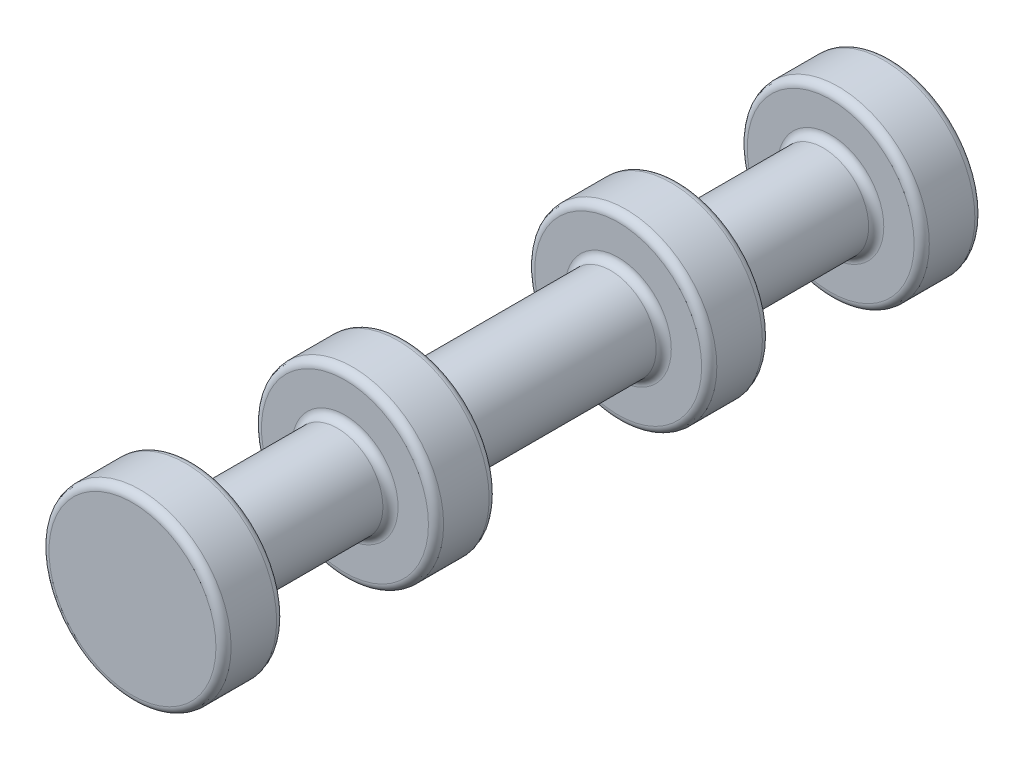
ISO-10303-21;
HEADER;
FILE_DESCRIPTION(('STEP AP214'),'2;1');
FILE_NAME('part.step','',(''),(''),'','','');
FILE_SCHEMA(('AUTOMOTIVE_DESIGN { 1 0 10303 214 1 1 1 1 }'));
ENDSEC;
DATA;
#1=APPLICATION_CONTEXT('core data for automotive mechanical design processes');
#2=APPLICATION_PROTOCOL_DEFINITION('international standard','automotive_design',2000,#1);
#3=PRODUCT_CONTEXT('',#1,'mechanical');
#4=PRODUCT('Part','Part','',(#3));
#5=PRODUCT_RELATED_PRODUCT_CATEGORY('part','',(#4));
#6=PRODUCT_DEFINITION_FORMATION('','',#4);
#7=PRODUCT_DEFINITION_CONTEXT('part definition',#1,'design');
#8=PRODUCT_DEFINITION('design','',#6,#7);
#9=PRODUCT_DEFINITION_SHAPE('','',#8);
#10=(LENGTH_UNIT() NAMED_UNIT(*) SI_UNIT(.MILLI.,.METRE.));
#11=(NAMED_UNIT(*) PLANE_ANGLE_UNIT() SI_UNIT($,.RADIAN.));
#12=(NAMED_UNIT(*) SI_UNIT($,.STERADIAN.) SOLID_ANGLE_UNIT());
#13=UNCERTAINTY_MEASURE_WITH_UNIT(LENGTH_MEASURE(1.E-05),#10,'distance_accuracy_value','');
#14=(GEOMETRIC_REPRESENTATION_CONTEXT(3) GLOBAL_UNCERTAINTY_ASSIGNED_CONTEXT((#13)) GLOBAL_UNIT_ASSIGNED_CONTEXT((#10,
#11,#12)) REPRESENTATION_CONTEXT('',''));
#15=CARTESIAN_POINT('',(0.,0.,0.));
#16=DIRECTION('',(0.,0.,1.));
#17=DIRECTION('',(1.,0.,0.));
#18=AXIS2_PLACEMENT_3D('',#15,#16,#17);
#19=CARTESIAN_POINT('',(-0.84804753819847,0.,9.76740237690729));
#20=DIRECTION('',(0.,0.,-1.));
#21=DIRECTION('',(-1.,0.,0.));
#22=AXIS2_PLACEMENT_3D('',#19,#20,#21);
#23=PLANE('',#22);
#24=CARTESIAN_POINT('',(-0.84804753819847,0.,9.76740237690729));
#25=DIRECTION('',(0.,0.,1.));
#26=DIRECTION('',(1.,0.,0.));
#27=AXIS2_PLACEMENT_3D('',#24,#25,#26);
#28=CIRCLE('',#27,2.75);
#29=CARTESIAN_POINT('',(1.90195246180153,0.,9.76740237690729));
#30=VERTEX_POINT('',#29);
#31=EDGE_CURVE('E10',#30,#30,#28,.T.);
#32=ORIENTED_EDGE('',*,*,#31,.T.);
#33=EDGE_LOOP('',(#32));
#34=FACE_BOUND('',#33,.T.);
#35=ADVANCED_FACE('F35',(#34),#23,.F.);
#36=CARTESIAN_POINT('',(-0.84804753819847,0.,9.51740237690729));
#37=DIRECTION('',(0.,0.,1.));
#38=DIRECTION('',(1.,0.,0.));
#39=AXIS2_PLACEMENT_3D('',#36,#37,#38);
#40=TOROIDAL_SURFACE('',#39,2.75,0.25);
#41=ORIENTED_EDGE('',*,*,#31,.F.);
#42=EDGE_LOOP('',(#41));
#43=FACE_BOUND('',#42,.T.);
#44=CARTESIAN_POINT('',(-0.84804753819847,0.,9.51740237690729));
#45=DIRECTION('',(0.,0.,1.));
#46=DIRECTION('',(1.,0.,0.));
#47=AXIS2_PLACEMENT_3D('',#44,#45,#46);
#48=CIRCLE('',#47,3.);
#49=CARTESIAN_POINT('',(2.15195246180153,0.,9.51740237690729));
#50=VERTEX_POINT('',#49);
#51=EDGE_CURVE('E41',#50,#50,#48,.T.);
#52=ORIENTED_EDGE('',*,*,#51,.T.);
#53=EDGE_LOOP('',(#52));
#54=FACE_BOUND('',#53,.T.);
#55=ADVANCED_FACE('F139',(#43,#54),#40,.T.);
#56=CARTESIAN_POINT('',(-0.84804753819847,0.,-0.674023769108006));
#57=DIRECTION('',(0.,0.,1.));
#58=DIRECTION('',(1.,0.,0.));
#59=AXIS2_PLACEMENT_3D('',#56,#57,#58);
#60=CYLINDRICAL_SURFACE('',#59,3.);
#61=ORIENTED_EDGE('',*,*,#51,.F.);
#62=EDGE_LOOP('',(#61));
#63=FACE_BOUND('',#62,.T.);
#64=CARTESIAN_POINT('',(-0.84804753819847,0.,8.01740237690729));
#65=DIRECTION('',(0.,0.,1.));
#66=DIRECTION('',(1.,0.,0.));
#67=AXIS2_PLACEMENT_3D('',#64,#65,#66);
#68=CIRCLE('',#67,3.);
#69=CARTESIAN_POINT('',(2.15195246180153,0.,8.01740237690729));
#70=VERTEX_POINT('',#69);
#71=EDGE_CURVE('E45',#70,#70,#68,.T.);
#72=ORIENTED_EDGE('',*,*,#71,.T.);
#73=EDGE_LOOP('',(#72));
#74=FACE_BOUND('',#73,.T.);
#75=ADVANCED_FACE('F143',(#63,#74),#60,.T.);
#76=CARTESIAN_POINT('',(-0.84804753819847,0.,8.01740237690729));
#77=DIRECTION('',(0.,0.,1.));
#78=DIRECTION('',(1.,0.,0.));
#79=AXIS2_PLACEMENT_3D('',#76,#77,#78);
#80=TOROIDAL_SURFACE('',#79,2.75,0.25);
#81=ORIENTED_EDGE('',*,*,#71,.F.);
#82=EDGE_LOOP('',(#81));
#83=FACE_BOUND('',#82,.T.);
#84=CARTESIAN_POINT('',(-0.84804753819847,0.,7.76740237690729));
#85=DIRECTION('',(0.,0.,1.));
#86=DIRECTION('',(1.,0.,0.));
#87=AXIS2_PLACEMENT_3D('',#84,#85,#86);
#88=CIRCLE('',#87,2.75);
#89=CARTESIAN_POINT('',(1.90195246180153,0.,7.76740237690729));
#90=VERTEX_POINT('',#89);
#91=EDGE_CURVE('E49',#90,#90,#88,.T.);
#92=ORIENTED_EDGE('',*,*,#91,.T.);
#93=EDGE_LOOP('',(#92));
#94=FACE_BOUND('',#93,.T.);
#95=ADVANCED_FACE('F148',(#83,#94),#80,.T.);
#96=CARTESIAN_POINT('',(-3.59804753819847,0.,7.76740237690729));
#97=DIRECTION('',(0.,0.,1.));
#98=DIRECTION('',(1.,0.,0.));
#99=AXIS2_PLACEMENT_3D('',#96,#97,#98);
#100=PLANE('',#99);
#101=ORIENTED_EDGE('',*,*,#91,.F.);
#102=EDGE_LOOP('',(#101));
#103=FACE_BOUND('',#102,.T.);
#104=CARTESIAN_POINT('',(-0.84804753819847,0.,7.76740237690729));
#105=DIRECTION('',(0.,0.,1.));
#106=DIRECTION('',(1.,0.,0.));
#107=AXIS2_PLACEMENT_3D('',#104,#105,#106);
#108=CIRCLE('',#107,1.75);
#109=CARTESIAN_POINT('',(0.901952461801532,0.,7.76740237690729));
#110=VERTEX_POINT('',#109);
#111=EDGE_CURVE('E54',#110,#110,#108,.T.);
#112=ORIENTED_EDGE('',*,*,#111,.T.);
#113=EDGE_LOOP('',(#112));
#114=FACE_BOUND('',#113,.T.);
#115=ADVANCED_FACE('F154',(#103,#114),#100,.F.);
#116=CARTESIAN_POINT('',(-0.84804753819847,0.,7.51740237690729));
#117=DIRECTION('',(0.,0.,1.));
#118=DIRECTION('',(1.,0.,0.));
#119=AXIS2_PLACEMENT_3D('',#116,#117,#118);
#120=TOROIDAL_SURFACE('',#119,1.75,0.25);
#121=ORIENTED_EDGE('',*,*,#111,.F.);
#122=EDGE_LOOP('',(#121));
#123=FACE_BOUND('',#122,.T.);
#124=CARTESIAN_POINT('',(-0.84804753819847,0.,7.51740237690729));
#125=DIRECTION('',(0.,0.,1.));
#126=DIRECTION('',(1.,0.,0.));
#127=AXIS2_PLACEMENT_3D('',#124,#125,#126);
#128=CIRCLE('',#127,1.5);
#129=CARTESIAN_POINT('',(0.65195246180153,0.,7.51740237690729));
#130=VERTEX_POINT('',#129);
#131=EDGE_CURVE('E57',#130,#130,#128,.T.);
#132=ORIENTED_EDGE('',*,*,#131,.T.);
#133=EDGE_LOOP('',(#132));
#134=FACE_BOUND('',#133,.T.);
#135=ADVANCED_FACE('F158',(#123,#134),#120,.F.);
#136=CARTESIAN_POINT('',(-0.84804753819847,0.,-0.674023769108006));
#137=DIRECTION('',(0.,0.,1.));
#138=DIRECTION('',(1.,0.,0.));
#139=AXIS2_PLACEMENT_3D('',#136,#137,#138);
#140=CYLINDRICAL_SURFACE('',#139,1.5);
#141=ORIENTED_EDGE('',*,*,#131,.F.);
#142=EDGE_LOOP('',(#141));
#143=FACE_BOUND('',#142,.T.);
#144=CARTESIAN_POINT('',(-0.84804753819847,0.,3.01740237690729));
#145=DIRECTION('',(0.,0.,1.));
#146=DIRECTION('',(1.,0.,0.));
#147=AXIS2_PLACEMENT_3D('',#144,#145,#146);
#148=CIRCLE('',#147,1.5);
#149=CARTESIAN_POINT('',(0.651952461801531,0.,3.01740237690729));
#150=VERTEX_POINT('',#149);
#151=EDGE_CURVE('E60',#150,#150,#148,.T.);
#152=ORIENTED_EDGE('',*,*,#151,.T.);
#153=EDGE_LOOP('',(#152));
#154=FACE_BOUND('',#153,.T.);
#155=ADVANCED_FACE('F162',(#143,#154),#140,.T.);
#156=CARTESIAN_POINT('',(-0.84804753819847,0.,3.01740237690729));
#157=DIRECTION('',(0.,0.,1.));
#158=DIRECTION('',(1.,0.,0.));
#159=AXIS2_PLACEMENT_3D('',#156,#157,#158);
#160=TOROIDAL_SURFACE('',#159,1.75,0.25);
#161=ORIENTED_EDGE('',*,*,#151,.F.);
#162=EDGE_LOOP('',(#161));
#163=FACE_BOUND('',#162,.T.);
#164=CARTESIAN_POINT('',(-0.84804753819847,0.,2.76740237690729));
#165=DIRECTION('',(0.,0.,1.));
#166=DIRECTION('',(1.,0.,0.));
#167=AXIS2_PLACEMENT_3D('',#164,#165,#166);
#168=CIRCLE('',#167,1.75);
#169=CARTESIAN_POINT('',(0.901952461801532,0.,2.76740237690729));
#170=VERTEX_POINT('',#169);
#171=EDGE_CURVE('E63',#170,#170,#168,.T.);
#172=ORIENTED_EDGE('',*,*,#171,.T.);
#173=EDGE_LOOP('',(#172));
#174=FACE_BOUND('',#173,.T.);
#175=ADVANCED_FACE('F166',(#163,#174),#160,.F.);
#176=CARTESIAN_POINT('',(-2.59804753819847,0.,2.76740237690729));
#177=DIRECTION('',(0.,0.,-1.));
#178=DIRECTION('',(-1.,0.,0.));
#179=AXIS2_PLACEMENT_3D('',#176,#177,#178);
#180=PLANE('',#179);
#181=ORIENTED_EDGE('',*,*,#171,.F.);
#182=EDGE_LOOP('',(#181));
#183=FACE_BOUND('',#182,.T.);
#184=CARTESIAN_POINT('',(-0.84804753819847,0.,2.76740237690729));
#185=DIRECTION('',(0.,0.,1.));
#186=DIRECTION('',(1.,0.,0.));
#187=AXIS2_PLACEMENT_3D('',#184,#185,#186);
#188=CIRCLE('',#187,2.75);
#189=CARTESIAN_POINT('',(1.90195246180153,0.,2.76740237690729));
#190=VERTEX_POINT('',#189);
#191=EDGE_CURVE('E66',#190,#190,#188,.T.);
#192=ORIENTED_EDGE('',*,*,#191,.T.);
#193=EDGE_LOOP('',(#192));
#194=FACE_BOUND('',#193,.T.);
#195=ADVANCED_FACE('F170',(#183,#194),#180,.F.);
#196=CARTESIAN_POINT('',(-0.84804753819847,0.,2.51740237690729));
#197=DIRECTION('',(0.,0.,1.));
#198=DIRECTION('',(1.,0.,0.));
#199=AXIS2_PLACEMENT_3D('',#196,#197,#198);
#200=TOROIDAL_SURFACE('',#199,2.75,0.25);
#201=ORIENTED_EDGE('',*,*,#191,.F.);
#202=EDGE_LOOP('',(#201));
#203=FACE_BOUND('',#202,.T.);
#204=CARTESIAN_POINT('',(-0.84804753819847,0.,2.51740237690729));
#205=DIRECTION('',(0.,0.,1.));
#206=DIRECTION('',(1.,0.,0.));
#207=AXIS2_PLACEMENT_3D('',#204,#205,#206);
#208=CIRCLE('',#207,3.);
#209=CARTESIAN_POINT('',(2.15195246180153,0.,2.51740237690729));
#210=VERTEX_POINT('',#209);
#211=EDGE_CURVE('E69',#210,#210,#208,.T.);
#212=ORIENTED_EDGE('',*,*,#211,.T.);
#213=EDGE_LOOP('',(#212));
#214=FACE_BOUND('',#213,.T.);
#215=ADVANCED_FACE('F174',(#203,#214),#200,.T.);
#216=CARTESIAN_POINT('',(-0.84804753819847,0.,-0.674023769108006));
#217=DIRECTION('',(0.,0.,1.));
#218=DIRECTION('',(1.,0.,0.));
#219=AXIS2_PLACEMENT_3D('',#216,#217,#218);
#220=CYLINDRICAL_SURFACE('',#219,3.);
#221=ORIENTED_EDGE('',*,*,#211,.F.);
#222=EDGE_LOOP('',(#221));
#223=FACE_BOUND('',#222,.T.);
#224=CARTESIAN_POINT('',(-0.84804753819847,0.,1.01740237690729));
#225=DIRECTION('',(0.,0.,1.));
#226=DIRECTION('',(1.,0.,0.));
#227=AXIS2_PLACEMENT_3D('',#224,#225,#226);
#228=CIRCLE('',#227,3.);
#229=CARTESIAN_POINT('',(2.15195246180153,0.,1.01740237690729));
#230=VERTEX_POINT('',#229);
#231=EDGE_CURVE('E72',#230,#230,#228,.T.);
#232=ORIENTED_EDGE('',*,*,#231,.T.);
#233=EDGE_LOOP('',(#232));
#234=FACE_BOUND('',#233,.T.);
#235=ADVANCED_FACE('F178',(#223,#234),#220,.T.);
#236=CARTESIAN_POINT('',(-0.84804753819847,0.,1.01740237690729));
#237=DIRECTION('',(0.,0.,1.));
#238=DIRECTION('',(1.,0.,0.));
#239=AXIS2_PLACEMENT_3D('',#236,#237,#238);
#240=TOROIDAL_SURFACE('',#239,2.75,0.25);
#241=ORIENTED_EDGE('',*,*,#231,.F.);
#242=EDGE_LOOP('',(#241));
#243=FACE_BOUND('',#242,.T.);
#244=CARTESIAN_POINT('',(-0.84804753819847,0.,0.767402376907291));
#245=DIRECTION('',(0.,0.,1.));
#246=DIRECTION('',(1.,0.,0.));
#247=AXIS2_PLACEMENT_3D('',#244,#245,#246);
#248=CIRCLE('',#247,2.75);
#249=CARTESIAN_POINT('',(1.90195246180153,0.,0.767402376907291));
#250=VERTEX_POINT('',#249);
#251=EDGE_CURVE('E75',#250,#250,#248,.T.);
#252=ORIENTED_EDGE('',*,*,#251,.T.);
#253=EDGE_LOOP('',(#252));
#254=FACE_BOUND('',#253,.T.);
#255=ADVANCED_FACE('F182',(#243,#254),#240,.T.);
#256=CARTESIAN_POINT('',(-3.59804753819847,0.,0.767402376907291));
#257=DIRECTION('',(0.,0.,1.));
#258=DIRECTION('',(1.,0.,0.));
#259=AXIS2_PLACEMENT_3D('',#256,#257,#258);
#260=PLANE('',#259);
#261=ORIENTED_EDGE('',*,*,#251,.F.);
#262=EDGE_LOOP('',(#261));
#263=FACE_BOUND('',#262,.T.);
#264=CARTESIAN_POINT('',(-0.84804753819847,0.,0.767402376907291));
#265=DIRECTION('',(0.,0.,1.));
#266=DIRECTION('',(1.,0.,0.));
#267=AXIS2_PLACEMENT_3D('',#264,#265,#266);
#268=CIRCLE('',#267,1.75);
#269=CARTESIAN_POINT('',(0.901952461801532,0.,0.767402376907291));
#270=VERTEX_POINT('',#269);
#271=EDGE_CURVE('E78',#270,#270,#268,.T.);
#272=ORIENTED_EDGE('',*,*,#271,.T.);
#273=EDGE_LOOP('',(#272));
#274=FACE_BOUND('',#273,.T.);
#275=ADVANCED_FACE('F186',(#263,#274),#260,.F.);
#276=CARTESIAN_POINT('',(-0.84804753819847,0.,0.517402376907291));
#277=DIRECTION('',(0.,0.,1.));
#278=DIRECTION('',(1.,0.,0.));
#279=AXIS2_PLACEMENT_3D('',#276,#277,#278);
#280=TOROIDAL_SURFACE('',#279,1.75,0.25);
#281=ORIENTED_EDGE('',*,*,#271,.F.);
#282=EDGE_LOOP('',(#281));
#283=FACE_BOUND('',#282,.T.);
#284=CARTESIAN_POINT('',(-0.84804753819847,0.,0.51740237690729));
#285=DIRECTION('',(0.,0.,1.));
#286=DIRECTION('',(1.,0.,0.));
#287=AXIS2_PLACEMENT_3D('',#284,#285,#286);
#288=CIRCLE('',#287,1.5);
#289=CARTESIAN_POINT('',(0.651952461801531,0.,0.51740237690729));
#290=VERTEX_POINT('',#289);
#291=EDGE_CURVE('E81',#290,#290,#288,.T.);
#292=ORIENTED_EDGE('',*,*,#291,.T.);
#293=EDGE_LOOP('',(#292));
#294=FACE_BOUND('',#293,.T.);
#295=ADVANCED_FACE('F190',(#283,#294),#280,.F.);
#296=CARTESIAN_POINT('',(-0.84804753819847,0.,-0.674023769108006));
#297=DIRECTION('',(0.,0.,1.));
#298=DIRECTION('',(1.,0.,0.));
#299=AXIS2_PLACEMENT_3D('',#296,#297,#298);
#300=CYLINDRICAL_SURFACE('',#299,1.5);
#301=ORIENTED_EDGE('',*,*,#291,.F.);
#302=EDGE_LOOP('',(#301));
#303=FACE_BOUND('',#302,.T.);
#304=CARTESIAN_POINT('',(-0.84804753819847,0.,-5.9825976230927));
#305=DIRECTION('',(0.,0.,1.));
#306=DIRECTION('',(1.,0.,0.));
#307=AXIS2_PLACEMENT_3D('',#304,#305,#306);
#308=CIRCLE('',#307,1.5);
#309=CARTESIAN_POINT('',(0.651952461801531,0.,-5.9825976230927));
#310=VERTEX_POINT('',#309);
#311=EDGE_CURVE('E84',#310,#310,#308,.T.);
#312=ORIENTED_EDGE('',*,*,#311,.T.);
#313=EDGE_LOOP('',(#312));
#314=FACE_BOUND('',#313,.T.);
#315=ADVANCED_FACE('F194',(#303,#314),#300,.T.);
#316=CARTESIAN_POINT('',(-0.84804753819847,0.,-5.98259762309271));
#317=DIRECTION('',(0.,0.,1.));
#318=DIRECTION('',(1.,0.,0.));
#319=AXIS2_PLACEMENT_3D('',#316,#317,#318);
#320=TOROIDAL_SURFACE('',#319,1.75,0.25);
#321=ORIENTED_EDGE('',*,*,#311,.F.);
#322=EDGE_LOOP('',(#321));
#323=FACE_BOUND('',#322,.T.);
#324=CARTESIAN_POINT('',(-0.84804753819847,0.,-6.23259762309271));
#325=DIRECTION('',(0.,0.,1.));
#326=DIRECTION('',(1.,0.,0.));
#327=AXIS2_PLACEMENT_3D('',#324,#325,#326);
#328=CIRCLE('',#327,1.75);
#329=CARTESIAN_POINT('',(0.901952461801532,0.,-6.23259762309271));
#330=VERTEX_POINT('',#329);
#331=EDGE_CURVE('E87',#330,#330,#328,.T.);
#332=ORIENTED_EDGE('',*,*,#331,.T.);
#333=EDGE_LOOP('',(#332));
#334=FACE_BOUND('',#333,.T.);
#335=ADVANCED_FACE('F198',(#323,#334),#320,.F.);
#336=CARTESIAN_POINT('',(-2.59804753819847,0.,-6.23259762309271));
#337=DIRECTION('',(0.,0.,-1.));
#338=DIRECTION('',(-1.,0.,0.));
#339=AXIS2_PLACEMENT_3D('',#336,#337,#338);
#340=PLANE('',#339);
#341=ORIENTED_EDGE('',*,*,#331,.F.);
#342=EDGE_LOOP('',(#341));
#343=FACE_BOUND('',#342,.T.);
#344=CARTESIAN_POINT('',(-0.84804753819847,0.,-6.23259762309271));
#345=DIRECTION('',(0.,0.,1.));
#346=DIRECTION('',(1.,0.,0.));
#347=AXIS2_PLACEMENT_3D('',#344,#345,#346);
#348=CIRCLE('',#347,2.75);
#349=CARTESIAN_POINT('',(1.90195246180153,0.,-6.23259762309271));
#350=VERTEX_POINT('',#349);
#351=EDGE_CURVE('E90',#350,#350,#348,.T.);
#352=ORIENTED_EDGE('',*,*,#351,.T.);
#353=EDGE_LOOP('',(#352));
#354=FACE_BOUND('',#353,.T.);
#355=ADVANCED_FACE('F202',(#343,#354),#340,.F.);
#356=CARTESIAN_POINT('',(-0.84804753819847,0.,-6.48259762309271));
#357=DIRECTION('',(0.,0.,1.));
#358=DIRECTION('',(1.,0.,0.));
#359=AXIS2_PLACEMENT_3D('',#356,#357,#358);
#360=TOROIDAL_SURFACE('',#359,2.75,0.25);
#361=ORIENTED_EDGE('',*,*,#351,.F.);
#362=EDGE_LOOP('',(#361));
#363=FACE_BOUND('',#362,.T.);
#364=CARTESIAN_POINT('',(-0.84804753819847,0.,-6.48259762309271));
#365=DIRECTION('',(0.,0.,1.));
#366=DIRECTION('',(1.,0.,0.));
#367=AXIS2_PLACEMENT_3D('',#364,#365,#366);
#368=CIRCLE('',#367,3.);
#369=CARTESIAN_POINT('',(2.15195246180153,0.,-6.48259762309271));
#370=VERTEX_POINT('',#369);
#371=EDGE_CURVE('E93',#370,#370,#368,.T.);
#372=ORIENTED_EDGE('',*,*,#371,.T.);
#373=EDGE_LOOP('',(#372));
#374=FACE_BOUND('',#373,.T.);
#375=ADVANCED_FACE('F206',(#363,#374),#360,.T.);
#376=CARTESIAN_POINT('',(-0.84804753819847,0.,-0.674023769108006));
#377=DIRECTION('',(0.,0.,1.));
#378=DIRECTION('',(1.,0.,0.));
#379=AXIS2_PLACEMENT_3D('',#376,#377,#378);
#380=CYLINDRICAL_SURFACE('',#379,3.);
#381=ORIENTED_EDGE('',*,*,#371,.F.);
#382=EDGE_LOOP('',(#381));
#383=FACE_BOUND('',#382,.T.);
#384=CARTESIAN_POINT('',(-0.84804753819847,0.,-7.98259762309271));
#385=DIRECTION('',(0.,0.,1.));
#386=DIRECTION('',(1.,0.,0.));
#387=AXIS2_PLACEMENT_3D('',#384,#385,#386);
#388=CIRCLE('',#387,3.);
#389=CARTESIAN_POINT('',(2.15195246180153,0.,-7.98259762309271));
#390=VERTEX_POINT('',#389);
#391=EDGE_CURVE('E96',#390,#390,#388,.T.);
#392=ORIENTED_EDGE('',*,*,#391,.T.);
#393=EDGE_LOOP('',(#392));
#394=FACE_BOUND('',#393,.T.);
#395=ADVANCED_FACE('F210',(#383,#394),#380,.T.);
#396=CARTESIAN_POINT('',(-0.84804753819847,0.,-7.98259762309271));
#397=DIRECTION('',(0.,0.,1.));
#398=DIRECTION('',(1.,0.,0.));
#399=AXIS2_PLACEMENT_3D('',#396,#397,#398);
#400=TOROIDAL_SURFACE('',#399,2.75,0.25);
#401=ORIENTED_EDGE('',*,*,#391,.F.);
#402=EDGE_LOOP('',(#401));
#403=FACE_BOUND('',#402,.T.);
#404=CARTESIAN_POINT('',(-0.84804753819847,0.,-8.23259762309271));
#405=DIRECTION('',(0.,0.,1.));
#406=DIRECTION('',(1.,0.,0.));
#407=AXIS2_PLACEMENT_3D('',#404,#405,#406);
#408=CIRCLE('',#407,2.75);
#409=CARTESIAN_POINT('',(1.90195246180153,0.,-8.23259762309271));
#410=VERTEX_POINT('',#409);
#411=EDGE_CURVE('E99',#410,#410,#408,.T.);
#412=ORIENTED_EDGE('',*,*,#411,.T.);
#413=EDGE_LOOP('',(#412));
#414=FACE_BOUND('',#413,.T.);
#415=ADVANCED_FACE('F214',(#403,#414),#400,.T.);
#416=CARTESIAN_POINT('',(-3.59804753819847,0.,-8.23259762309271));
#417=DIRECTION('',(0.,0.,1.));
#418=DIRECTION('',(1.,0.,0.));
#419=AXIS2_PLACEMENT_3D('',#416,#417,#418);
#420=PLANE('',#419);
#421=ORIENTED_EDGE('',*,*,#411,.F.);
#422=EDGE_LOOP('',(#421));
#423=FACE_BOUND('',#422,.T.);
#424=CARTESIAN_POINT('',(-0.84804753819847,0.,-8.23259762309271));
#425=DIRECTION('',(0.,0.,1.));
#426=DIRECTION('',(1.,0.,0.));
#427=AXIS2_PLACEMENT_3D('',#424,#425,#426);
#428=CIRCLE('',#427,1.75);
#429=CARTESIAN_POINT('',(0.901952461801532,0.,-8.23259762309271));
#430=VERTEX_POINT('',#429);
#431=EDGE_CURVE('E102',#430,#430,#428,.T.);
#432=ORIENTED_EDGE('',*,*,#431,.T.);
#433=EDGE_LOOP('',(#432));
#434=FACE_BOUND('',#433,.T.);
#435=ADVANCED_FACE('F218',(#423,#434),#420,.F.);
#436=CARTESIAN_POINT('',(-0.84804753819847,0.,-8.48259762309271));
#437=DIRECTION('',(0.,0.,1.));
#438=DIRECTION('',(1.,0.,0.));
#439=AXIS2_PLACEMENT_3D('',#436,#437,#438);
#440=TOROIDAL_SURFACE('',#439,1.75,0.25);
#441=ORIENTED_EDGE('',*,*,#431,.F.);
#442=EDGE_LOOP('',(#441));
#443=FACE_BOUND('',#442,.T.);
#444=CARTESIAN_POINT('',(-0.84804753819847,0.,-8.48259762309271));
#445=DIRECTION('',(0.,0.,1.));
#446=DIRECTION('',(1.,0.,0.));
#447=AXIS2_PLACEMENT_3D('',#444,#445,#446);
#448=CIRCLE('',#447,1.5);
#449=CARTESIAN_POINT('',(0.65195246180153,0.,-8.48259762309271));
#450=VERTEX_POINT('',#449);
#451=EDGE_CURVE('E105',#450,#450,#448,.T.);
#452=ORIENTED_EDGE('',*,*,#451,.T.);
#453=EDGE_LOOP('',(#452));
#454=FACE_BOUND('',#453,.T.);
#455=ADVANCED_FACE('F222',(#443,#454),#440,.F.);
#456=CARTESIAN_POINT('',(-0.84804753819847,0.,-0.674023769108006));
#457=DIRECTION('',(0.,0.,1.));
#458=DIRECTION('',(1.,0.,0.));
#459=AXIS2_PLACEMENT_3D('',#456,#457,#458);
#460=CYLINDRICAL_SURFACE('',#459,1.5);
#461=ORIENTED_EDGE('',*,*,#451,.F.);
#462=EDGE_LOOP('',(#461));
#463=FACE_BOUND('',#462,.T.);
#464=CARTESIAN_POINT('',(-0.84804753819847,0.,-12.9825976230927));
#465=DIRECTION('',(0.,0.,1.));
#466=DIRECTION('',(1.,0.,0.));
#467=AXIS2_PLACEMENT_3D('',#464,#465,#466);
#468=CIRCLE('',#467,1.5);
#469=CARTESIAN_POINT('',(0.651952461801531,0.,-12.9825976230927));
#470=VERTEX_POINT('',#469);
#471=EDGE_CURVE('E108',#470,#470,#468,.T.);
#472=ORIENTED_EDGE('',*,*,#471,.T.);
#473=EDGE_LOOP('',(#472));
#474=FACE_BOUND('',#473,.T.);
#475=ADVANCED_FACE('F226',(#463,#474),#460,.T.);
#476=CARTESIAN_POINT('',(-0.84804753819847,0.,-12.9825976230927));
#477=DIRECTION('',(0.,0.,1.));
#478=DIRECTION('',(1.,0.,0.));
#479=AXIS2_PLACEMENT_3D('',#476,#477,#478);
#480=TOROIDAL_SURFACE('',#479,1.75,0.25);
#481=ORIENTED_EDGE('',*,*,#471,.F.);
#482=EDGE_LOOP('',(#481));
#483=FACE_BOUND('',#482,.T.);
#484=CARTESIAN_POINT('',(-0.84804753819847,0.,-13.2325976230927));
#485=DIRECTION('',(0.,0.,1.));
#486=DIRECTION('',(1.,0.,0.));
#487=AXIS2_PLACEMENT_3D('',#484,#485,#486);
#488=CIRCLE('',#487,1.75);
#489=CARTESIAN_POINT('',(0.901952461801533,0.,-13.2325976230927));
#490=VERTEX_POINT('',#489);
#491=EDGE_CURVE('E111',#490,#490,#488,.T.);
#492=ORIENTED_EDGE('',*,*,#491,.T.);
#493=EDGE_LOOP('',(#492));
#494=FACE_BOUND('',#493,.T.);
#495=ADVANCED_FACE('F230',(#483,#494),#480,.F.);
#496=CARTESIAN_POINT('',(-2.59804753819847,0.,-13.2325976230927));
#497=DIRECTION('',(0.,0.,-1.));
#498=DIRECTION('',(-1.,0.,0.));
#499=AXIS2_PLACEMENT_3D('',#496,#497,#498);
#500=PLANE('',#499);
#501=ORIENTED_EDGE('',*,*,#491,.F.);
#502=EDGE_LOOP('',(#501));
#503=FACE_BOUND('',#502,.T.);
#504=CARTESIAN_POINT('',(-0.84804753819847,0.,-13.2325976230927));
#505=DIRECTION('',(0.,0.,1.));
#506=DIRECTION('',(1.,0.,0.));
#507=AXIS2_PLACEMENT_3D('',#504,#505,#506);
#508=CIRCLE('',#507,2.75000000000001);
#509=CARTESIAN_POINT('',(1.90195246180154,0.,-13.2325976230927));
#510=VERTEX_POINT('',#509);
#511=EDGE_CURVE('E114',#510,#510,#508,.T.);
#512=ORIENTED_EDGE('',*,*,#511,.T.);
#513=EDGE_LOOP('',(#512));
#514=FACE_BOUND('',#513,.T.);
#515=ADVANCED_FACE('F234',(#503,#514),#500,.F.);
#516=CARTESIAN_POINT('',(-0.84804753819847,0.,-13.4825976230927));
#517=DIRECTION('',(0.,0.,1.));
#518=DIRECTION('',(1.,0.,0.));
#519=AXIS2_PLACEMENT_3D('',#516,#517,#518);
#520=TOROIDAL_SURFACE('',#519,2.75000000000001,0.25);
#521=ORIENTED_EDGE('',*,*,#511,.F.);
#522=EDGE_LOOP('',(#521));
#523=FACE_BOUND('',#522,.T.);
#524=CARTESIAN_POINT('',(-0.84804753819847,0.,-13.4825976230927));
#525=DIRECTION('',(0.,0.,1.));
#526=DIRECTION('',(1.,0.,0.));
#527=AXIS2_PLACEMENT_3D('',#524,#525,#526);
#528=CIRCLE('',#527,3.00000000000001);
#529=CARTESIAN_POINT('',(2.15195246180154,0.,-13.4825976230927));
#530=VERTEX_POINT('',#529);
#531=EDGE_CURVE('E117',#530,#530,#528,.T.);
#532=ORIENTED_EDGE('',*,*,#531,.T.);
#533=EDGE_LOOP('',(#532));
#534=FACE_BOUND('',#533,.T.);
#535=ADVANCED_FACE('F238',(#523,#534),#520,.T.);
#536=CARTESIAN_POINT('',(-0.84804753819847,0.,-0.674023769108006));
#537=DIRECTION('',(0.,0.,1.));
#538=DIRECTION('',(1.,0.,0.));
#539=AXIS2_PLACEMENT_3D('',#536,#537,#538);
#540=CYLINDRICAL_SURFACE('',#539,3.00000000000001);
#541=ORIENTED_EDGE('',*,*,#531,.F.);
#542=EDGE_LOOP('',(#541));
#543=FACE_BOUND('',#542,.T.);
#544=CARTESIAN_POINT('',(-0.84804753819847,0.,-14.9825976230927));
#545=DIRECTION('',(0.,0.,1.));
#546=DIRECTION('',(1.,0.,0.));
#547=AXIS2_PLACEMENT_3D('',#544,#545,#546);
#548=CIRCLE('',#547,3.00000000000001);
#549=CARTESIAN_POINT('',(2.15195246180154,0.,-14.9825976230927));
#550=VERTEX_POINT('',#549);
#551=EDGE_CURVE('E120',#550,#550,#548,.T.);
#552=ORIENTED_EDGE('',*,*,#551,.T.);
#553=EDGE_LOOP('',(#552));
#554=FACE_BOUND('',#553,.T.);
#555=ADVANCED_FACE('F135',(#543,#554),#540,.T.);
#556=CARTESIAN_POINT('',(-0.84804753819847,0.,-14.9825976230927));
#557=DIRECTION('',(0.,0.,1.));
#558=DIRECTION('',(1.,0.,0.));
#559=AXIS2_PLACEMENT_3D('',#556,#557,#558);
#560=TOROIDAL_SURFACE('',#559,2.75000000000001,0.25);
#561=ORIENTED_EDGE('',*,*,#551,.F.);
#562=EDGE_LOOP('',(#561));
#563=FACE_BOUND('',#562,.T.);
#564=CARTESIAN_POINT('',(-0.84804753819847,0.,-15.2325976230927));
#565=DIRECTION('',(0.,0.,1.));
#566=DIRECTION('',(1.,0.,0.));
#567=AXIS2_PLACEMENT_3D('',#564,#565,#566);
#568=CIRCLE('',#567,2.75000000000001);
#569=CARTESIAN_POINT('',(1.90195246180154,0.,-15.2325976230927));
#570=VERTEX_POINT('',#569);
#571=EDGE_CURVE('E123',#570,#570,#568,.T.);
#572=ORIENTED_EDGE('',*,*,#571,.T.);
#573=EDGE_LOOP('',(#572));
#574=FACE_BOUND('',#573,.T.);
#575=ADVANCED_FACE('F127',(#563,#574),#560,.T.);
#576=CARTESIAN_POINT('',(-3.59804753819848,0.,-15.2325976230927));
#577=DIRECTION('',(0.,0.,1.));
#578=DIRECTION('',(1.,0.,0.));
#579=AXIS2_PLACEMENT_3D('',#576,#577,#578);
#580=PLANE('',#579);
#581=ORIENTED_EDGE('',*,*,#571,.F.);
#582=EDGE_LOOP('',(#581));
#583=FACE_BOUND('',#582,.T.);
#584=ADVANCED_FACE('F129',(#583),#580,.F.);
#585=CLOSED_SHELL('',(#35,#55,#75,#95,#115,#135,#155,#175,#195,#215,#235,#255,#275,#295,#315,
#335,#355,#375,#395,#415,#435,#455,#475,#495,#515,#535,#555,#575,#584));
#586=MANIFOLD_SOLID_BREP('B2',#585);
#587=ADVANCED_BREP_SHAPE_REPRESENTATION('',(#18,#586),#14);
#588=SHAPE_DEFINITION_REPRESENTATION(#9,#587);
ENDSEC;
END-ISO-10303-21;
